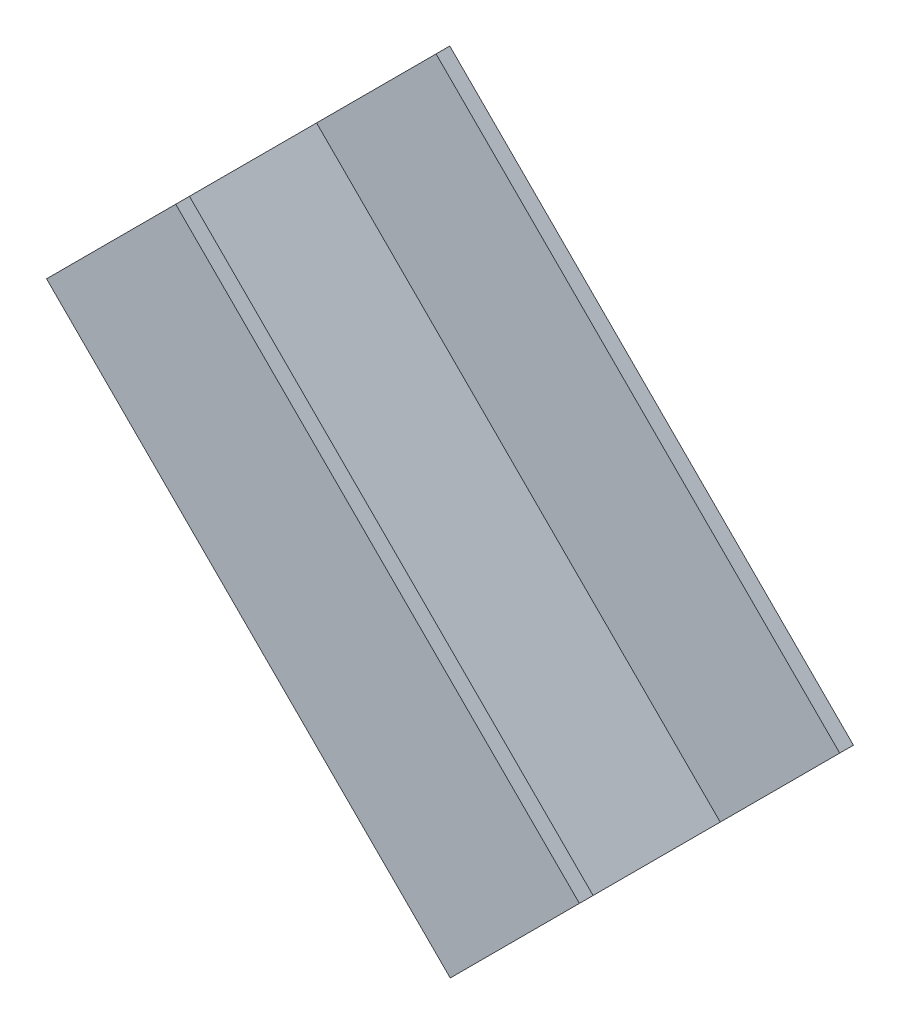
ISO-10303-21;
HEADER;
FILE_DESCRIPTION(('STEP AP214'),'2;1');
FILE_NAME('part.step','',(''),(''),'','','');
FILE_SCHEMA(('AUTOMOTIVE_DESIGN { 1 0 10303 214 1 1 1 1 }'));
ENDSEC;
DATA;
#1=APPLICATION_CONTEXT('core data for automotive mechanical design processes');
#2=APPLICATION_PROTOCOL_DEFINITION('international standard','automotive_design',2000,#1);
#3=PRODUCT_CONTEXT('',#1,'mechanical');
#4=PRODUCT('Part','Part','',(#3));
#5=PRODUCT_RELATED_PRODUCT_CATEGORY('part','',(#4));
#6=PRODUCT_DEFINITION_FORMATION('','',#4);
#7=PRODUCT_DEFINITION_CONTEXT('part definition',#1,'design');
#8=PRODUCT_DEFINITION('design','',#6,#7);
#9=PRODUCT_DEFINITION_SHAPE('','',#8);
#10=(LENGTH_UNIT() NAMED_UNIT(*) SI_UNIT(.MILLI.,.METRE.));
#11=(NAMED_UNIT(*) PLANE_ANGLE_UNIT() SI_UNIT($,.RADIAN.));
#12=(NAMED_UNIT(*) SI_UNIT($,.STERADIAN.) SOLID_ANGLE_UNIT());
#13=UNCERTAINTY_MEASURE_WITH_UNIT(LENGTH_MEASURE(1.E-05),#10,'distance_accuracy_value','');
#14=(GEOMETRIC_REPRESENTATION_CONTEXT(3) GLOBAL_UNCERTAINTY_ASSIGNED_CONTEXT((#13)) GLOBAL_UNIT_ASSIGNED_CONTEXT((#10,
#11,#12)) REPRESENTATION_CONTEXT('',''));
#15=CARTESIAN_POINT('',(0.,0.,0.));
#16=DIRECTION('',(0.,0.,1.));
#17=DIRECTION('',(1.,0.,0.));
#18=AXIS2_PLACEMENT_3D('',#15,#16,#17);
#19=CARTESIAN_POINT('',(-21.371733371294,-1.77362493427944,-0.0329990139287155));
#20=CARTESIAN_POINT('',(-21.3717333724067,-1.77362493631395,0.00300098607128494));
#21=CARTESIAN_POINT('',(-22.4323935430739,-0.712964762499555,-0.032998986769929));
#22=CARTESIAN_POINT('',(-22.4323935441866,-0.712964764534064,0.00300101323007142));
#23=(BOUNDED_SURFACE() B_SPLINE_SURFACE(1,1,((#19,#20),(#21,#22)),.UNSPECIFIED.,.F.,.F.,
.F.) B_SPLINE_SURFACE_WITH_KNOTS((2,2),(2,2),(-0.00137500000000004,0.000125000000000046),
(-3.00000000000031E-06,3.3E-05),
.UNSPECIFIED.) GEOMETRIC_REPRESENTATION_ITEM() RATIONAL_B_SPLINE_SURFACE(((1.,1.),(1.,1.))) REPRESENTATION_ITEM('') SURFACE());
#24=CARTESIAN_POINT('',(-22.3440051964456,-0.801353112012878,1.01096683888507E-06));
#25=CARTESIAN_POINT('',(-22.3440051955183,-0.801353110317454,-0.0299989890331612));
#26=(BOUNDED_CURVE() B_SPLINE_CURVE(1,(#24,#25),.UNSPECIFIED.,.F.,
.F.) B_SPLINE_CURVE_WITH_KNOTS((2,2),(-3.E-05,0.),
.UNSPECIFIED.) CURVE() GEOMETRIC_REPRESENTATION_ITEM() RATIONAL_B_SPLINE_CURVE((1.,1.)) REPRESENTATION_ITEM(''));
#27=CARTESIAN_POINT('',(-22.3440051964456,-0.801353112012876,1.0109668388894E-06));
#28=VERTEX_POINT('',#27);
#29=CARTESIAN_POINT('',(-22.3440051955183,-0.801353110317454,-0.0299989890331612));
#30=VERTEX_POINT('',#29);
#31=EDGE_CURVE('E85',#28,#30,#26,.T.);
#32=CARTESIAN_POINT('',(-21.4601217199623,-1.68523658849605,9.88334517091488E-07));
#33=CARTESIAN_POINT('',(-22.3440051964455,-0.801353112012814,1.01096683916167E-06));
#34=(BOUNDED_CURVE() B_SPLINE_CURVE(1,(#32,#33),.UNSPECIFIED.,.F.,
.F.) B_SPLINE_CURVE_WITH_KNOTS((2,2),(0.,0.00125000000000007),
.UNSPECIFIED.) CURVE() GEOMETRIC_REPRESENTATION_ITEM() RATIONAL_B_SPLINE_CURVE((1.,1.)) REPRESENTATION_ITEM(''));
#35=CARTESIAN_POINT('',(-21.4601217199623,-1.68523658849605,9.88334517091488E-07));
#36=VERTEX_POINT('',#35);
#37=EDGE_CURVE('E113',#36,#28,#34,.T.);
#38=CARTESIAN_POINT('',(-21.4601217199624,-1.68523658849605,9.88334517087151E-07));
#39=CARTESIAN_POINT('',(-21.4601217190351,-1.68523658680063,-0.029999011665483));
#40=(BOUNDED_CURVE() B_SPLINE_CURVE(1,(#38,#39),.UNSPECIFIED.,.F.,
.F.) B_SPLINE_CURVE_WITH_KNOTS((2,2),(-3.E-05,0.),
.UNSPECIFIED.) CURVE() GEOMETRIC_REPRESENTATION_ITEM() RATIONAL_B_SPLINE_CURVE((1.,1.)) REPRESENTATION_ITEM(''));
#41=CARTESIAN_POINT('',(-21.4601217190351,-1.68523658680063,-0.029999011665483));
#42=VERTEX_POINT('',#41);
#43=EDGE_CURVE('E87',#36,#42,#40,.T.);
#44=CARTESIAN_POINT('',(-21.4601217190351,-1.68523658680063,-0.029999011665483));
#45=CARTESIAN_POINT('',(-22.3440051955183,-0.801353110317442,-0.0299989890331609));
#46=(BOUNDED_CURVE() B_SPLINE_CURVE(1,(#44,#45),.UNSPECIFIED.,.F.,
.F.) B_SPLINE_CURVE_WITH_KNOTS((2,2),(0.,0.00125),
.UNSPECIFIED.) CURVE() GEOMETRIC_REPRESENTATION_ITEM() RATIONAL_B_SPLINE_CURVE((1.,1.)) REPRESENTATION_ITEM(''));
#47=EDGE_CURVE('E11',#42,#30,#46,.T.);
#48=ORIENTED_EDGE('',*,*,#31,.F.);
#49=ORIENTED_EDGE('',*,*,#37,.F.);
#50=ORIENTED_EDGE('',*,*,#43,.T.);
#51=ORIENTED_EDGE('',*,*,#47,.T.);
#52=EDGE_LOOP('',(#48,#49,#50,#51));
#53=FACE_BOUND('',#52,.T.);
#54=ADVANCED_FACE('F17',(#53),#23,.T.);
#55=CARTESIAN_POINT('',(-21.3455704204829,-1.74746198354504,-0.0299990116414784));
#56=CARTESIAN_POINT('',(-22.4062305922627,-0.686801811765215,-0.0299989844826919));
#57=CARTESIAN_POINT('',(-21.6595258313297,-2.06141739439192,-0.0299990390883204));
#58=CARTESIAN_POINT('',(-22.7201860031096,-1.0007572226121,-0.0299990119295339));
#59=(BOUNDED_SURFACE() B_SPLINE_SURFACE(1,1,((#55,#56),(#57,#58)),.UNSPECIFIED.,.F.,.F.,
.F.) B_SPLINE_SURFACE_WITH_KNOTS((2,2),(2,2),(-0.000407000000000068,3.70000000000087E-05),
(-0.000125000000000004,0.001375),
.UNSPECIFIED.) GEOMETRIC_REPRESENTATION_ITEM() RATIONAL_B_SPLINE_SURFACE(((1.,1.),(1.,1.))) REPRESENTATION_ITEM('') SURFACE());
#60=CARTESIAN_POINT('',(-22.3440051955183,-0.801353110317454,-0.0299989890331612));
#61=CARTESIAN_POINT('',(-22.6056347045573,-1.06298261935646,-0.0299990119055296));
#62=(BOUNDED_CURVE() B_SPLINE_CURVE(1,(#60,#61),.UNSPECIFIED.,.F.,
.F.) B_SPLINE_CURVE_WITH_KNOTS((2,2),(0.,0.000369999999999983),
.UNSPECIFIED.) CURVE() GEOMETRIC_REPRESENTATION_ITEM() RATIONAL_B_SPLINE_CURVE((1.,1.)) REPRESENTATION_ITEM(''));
#63=CARTESIAN_POINT('',(-22.6056347045573,-1.06298261935647,-0.0299990119055293));
#64=VERTEX_POINT('',#63);
#65=EDGE_CURVE('E89',#30,#64,#62,.T.);
#66=CARTESIAN_POINT('',(-21.4601217190351,-1.68523658680063,-0.029999011665483));
#67=CARTESIAN_POINT('',(-21.7217512280742,-1.9468660958397,-0.0299990345378514));
#68=(BOUNDED_CURVE() B_SPLINE_CURVE(1,(#66,#67),.UNSPECIFIED.,.F.,
.F.) B_SPLINE_CURVE_WITH_KNOTS((2,2),(0.,0.000370000000000062),
.UNSPECIFIED.) CURVE() GEOMETRIC_REPRESENTATION_ITEM() RATIONAL_B_SPLINE_CURVE((1.,1.)) REPRESENTATION_ITEM(''));
#69=CARTESIAN_POINT('',(-21.7217512280742,-1.94686609583966,-0.0299990345378515));
#70=VERTEX_POINT('',#69);
#71=EDGE_CURVE('E167',#42,#70,#68,.T.);
#72=CARTESIAN_POINT('',(-21.7217512280742,-1.94686609583966,-0.0299990345378515));
#73=CARTESIAN_POINT('',(-22.6056347045573,-1.06298261935651,-0.0299990119055294));
#74=(BOUNDED_CURVE() B_SPLINE_CURVE(1,(#72,#73),.UNSPECIFIED.,.F.,
.F.) B_SPLINE_CURVE_WITH_KNOTS((2,2),(0.,0.00124999999999995),
.UNSPECIFIED.) CURVE() GEOMETRIC_REPRESENTATION_ITEM() RATIONAL_B_SPLINE_CURVE((1.,1.)) REPRESENTATION_ITEM(''));
#75=EDGE_CURVE('E31',#70,#64,#74,.T.);
#76=ORIENTED_EDGE('',*,*,#65,.F.);
#77=ORIENTED_EDGE('',*,*,#47,.F.);
#78=ORIENTED_EDGE('',*,*,#71,.T.);
#79=ORIENTED_EDGE('',*,*,#75,.T.);
#80=EDGE_LOOP('',(#76,#77,#78,#79));
#81=FACE_BOUND('',#80,.T.);
#82=ADVANCED_FACE('F90',(#81),#59,.T.);
#83=CARTESIAN_POINT('',(-21.6333628620662,-2.0352544099186,-0.623999036801084));
#84=CARTESIAN_POINT('',(-21.6333628820949,-2.03525444653977,0.0240009631989165));
#85=CARTESIAN_POINT('',(-22.694023033846,-0.974594238138771,-0.623999009642297));
#86=CARTESIAN_POINT('',(-22.6940230538748,-0.974594274759936,0.0240009903577029));
#87=(BOUNDED_SURFACE() B_SPLINE_SURFACE(1,1,((#83,#84),(#85,#86)),.UNSPECIFIED.,.F.,.F.,
.F.) B_SPLINE_SURFACE_WITH_KNOTS((2,2),(2,2),(-0.00137499999999998,0.000125000000000037),
(-0.000594,5.4E-05),
.UNSPECIFIED.) GEOMETRIC_REPRESENTATION_ITEM() RATIONAL_B_SPLINE_SURFACE(((1.,1.),(1.,1.))) REPRESENTATION_ITEM('') SURFACE());
#88=CARTESIAN_POINT('',(-22.6056347045573,-1.06298261935647,-0.0299990119055293));
#89=CARTESIAN_POINT('',(-22.6056346878667,-1.06298258883883,-0.569999011905529));
#90=(BOUNDED_CURVE() B_SPLINE_CURVE(1,(#88,#89),.UNSPECIFIED.,.F.,
.F.) B_SPLINE_CURVE_WITH_KNOTS((2,2),(0.,0.00054),
.UNSPECIFIED.) CURVE() GEOMETRIC_REPRESENTATION_ITEM() RATIONAL_B_SPLINE_CURVE((1.,1.)) REPRESENTATION_ITEM(''));
#91=CARTESIAN_POINT('',(-22.6056346878667,-1.06298258883883,-0.569999011905529));
#92=VERTEX_POINT('',#91);
#93=EDGE_CURVE('E94',#64,#92,#90,.T.);
#94=CARTESIAN_POINT('',(-21.7217512280742,-1.94686609583966,-0.0299990345378515));
#95=CARTESIAN_POINT('',(-21.7217512113836,-1.94686606532202,-0.569999034537851));
#96=(BOUNDED_CURVE() B_SPLINE_CURVE(1,(#94,#95),.UNSPECIFIED.,.F.,
.F.) B_SPLINE_CURVE_WITH_KNOTS((2,2),(0.,0.00054),
.UNSPECIFIED.) CURVE() GEOMETRIC_REPRESENTATION_ITEM() RATIONAL_B_SPLINE_CURVE((1.,1.)) REPRESENTATION_ITEM(''));
#97=CARTESIAN_POINT('',(-21.7217512113835,-1.94686606532201,-0.569999034537851));
#98=VERTEX_POINT('',#97);
#99=EDGE_CURVE('E159',#70,#98,#96,.T.);
#100=CARTESIAN_POINT('',(-21.7217512113835,-1.94686606532201,-0.569999034537851));
#101=CARTESIAN_POINT('',(-22.6056346878667,-1.06298258883882,-0.569999011905529));
#102=(BOUNDED_CURVE() B_SPLINE_CURVE(1,(#100,#101),.UNSPECIFIED.,.F.,
.F.) B_SPLINE_CURVE_WITH_KNOTS((2,2),(0.,0.00125),
.UNSPECIFIED.) CURVE() GEOMETRIC_REPRESENTATION_ITEM() RATIONAL_B_SPLINE_CURVE((1.,1.)) REPRESENTATION_ITEM(''));
#103=EDGE_CURVE('E136',#98,#92,#102,.T.);
#104=ORIENTED_EDGE('',*,*,#93,.F.);
#105=ORIENTED_EDGE('',*,*,#75,.F.);
#106=ORIENTED_EDGE('',*,*,#99,.T.);
#107=ORIENTED_EDGE('',*,*,#103,.T.);
#108=EDGE_LOOP('',(#104,#105,#106,#107));
#109=FACE_BOUND('',#108,.T.);
#110=ADVANCED_FACE('F298',(#109),#87,.T.);
#111=CARTESIAN_POINT('',(-21.3455704037923,-1.74746195302742,-0.569999011641478));
#112=CARTESIAN_POINT('',(-21.6595258146391,-2.06141736387425,-0.56999903908832));
#113=CARTESIAN_POINT('',(-22.4062305755721,-0.686801781247578,-0.569998984482691));
#114=CARTESIAN_POINT('',(-22.7201859864189,-1.0007571920944,-0.569999011929534));
#115=(BOUNDED_SURFACE() B_SPLINE_SURFACE(1,1,((#111,#112),(#113,#114)),.UNSPECIFIED.,.F.,.F.,
.F.) B_SPLINE_SURFACE_WITH_KNOTS((2,2),(2,2),(-0.00137500000000003,0.000125000000000004),
(-0.000406999999999978,3.70000000000172E-05),
.UNSPECIFIED.) GEOMETRIC_REPRESENTATION_ITEM() RATIONAL_B_SPLINE_SURFACE(((1.,1.),(1.,1.))) REPRESENTATION_ITEM('') SURFACE());
#116=CARTESIAN_POINT('',(-22.6056346878667,-1.06298258883883,-0.569999011905529));
#117=CARTESIAN_POINT('',(-22.3440051788277,-0.801353079799819,-0.569998989033161));
#118=(BOUNDED_CURVE() B_SPLINE_CURVE(1,(#116,#117),.UNSPECIFIED.,.F.,
.F.) B_SPLINE_CURVE_WITH_KNOTS((2,2),(0.,0.000369999999999986),
.UNSPECIFIED.) CURVE() GEOMETRIC_REPRESENTATION_ITEM() RATIONAL_B_SPLINE_CURVE((1.,1.)) REPRESENTATION_ITEM(''));
#119=CARTESIAN_POINT('',(-22.3440051788277,-0.80135307979981,-0.56999898903316));
#120=VERTEX_POINT('',#119);
#121=EDGE_CURVE('E109',#92,#120,#118,.T.);
#122=CARTESIAN_POINT('',(-21.7217512113835,-1.94686606532201,-0.569999034537851));
#123=CARTESIAN_POINT('',(-21.4601217023445,-1.68523655628301,-0.569999011665483));
#124=(BOUNDED_CURVE() B_SPLINE_CURVE(1,(#122,#123),.UNSPECIFIED.,.F.,
.F.) B_SPLINE_CURVE_WITH_KNOTS((2,2),(0.,0.000369999999999976),
.UNSPECIFIED.) CURVE() GEOMETRIC_REPRESENTATION_ITEM() RATIONAL_B_SPLINE_CURVE((1.,1.)) REPRESENTATION_ITEM(''));
#125=CARTESIAN_POINT('',(-21.4601217023445,-1.685236556283,-0.569999011665483));
#126=VERTEX_POINT('',#125);
#127=EDGE_CURVE('E157',#98,#126,#124,.T.);
#128=CARTESIAN_POINT('',(-21.4601217023445,-1.685236556283,-0.569999011665483));
#129=CARTESIAN_POINT('',(-22.3440051788277,-0.801353079799805,-0.569998989033161));
#130=(BOUNDED_CURVE() B_SPLINE_CURVE(1,(#128,#129),.UNSPECIFIED.,.F.,
.F.) B_SPLINE_CURVE_WITH_KNOTS((2,2),(0.,0.00125000000000002),
.UNSPECIFIED.) CURVE() GEOMETRIC_REPRESENTATION_ITEM() RATIONAL_B_SPLINE_CURVE((1.,1.)) REPRESENTATION_ITEM(''));
#131=EDGE_CURVE('E127',#126,#120,#130,.T.);
#132=ORIENTED_EDGE('',*,*,#121,.F.);
#133=ORIENTED_EDGE('',*,*,#103,.F.);
#134=ORIENTED_EDGE('',*,*,#127,.T.);
#135=ORIENTED_EDGE('',*,*,#131,.T.);
#136=EDGE_LOOP('',(#132,#133,#134,#135));
#137=FACE_BOUND('',#136,.T.);
#138=ADVANCED_FACE('F302',(#137),#115,.T.);
#139=CARTESIAN_POINT('',(-21.3717333536762,-1.77362490206635,-0.602999013928715));
#140=CARTESIAN_POINT('',(-21.3717333547889,-1.77362490410086,-0.566999013928714));
#141=CARTESIAN_POINT('',(-22.432393525456,-0.712964730286492,-0.602998986769929));
#142=CARTESIAN_POINT('',(-22.4323935265687,-0.712964732321001,-0.566998986769928));
#143=(BOUNDED_SURFACE() B_SPLINE_SURFACE(1,1,((#139,#140),(#141,#142)),.UNSPECIFIED.,.F.,.F.,
.F.) B_SPLINE_SURFACE_WITH_KNOTS((2,2),(2,2),(-0.00137500000000005,0.000125000000000006),
(-0.000573,-0.000537),
.UNSPECIFIED.) GEOMETRIC_REPRESENTATION_ITEM() RATIONAL_B_SPLINE_SURFACE(((1.,1.),(1.,1.))) REPRESENTATION_ITEM('') SURFACE());
#144=CARTESIAN_POINT('',(-22.3440051788277,-0.801353079799814,-0.56999898903316));
#145=CARTESIAN_POINT('',(-22.3440051779004,-0.801353078104389,-0.599998989033161));
#146=(BOUNDED_CURVE() B_SPLINE_CURVE(1,(#144,#145),.UNSPECIFIED.,.F.,
.F.) B_SPLINE_CURVE_WITH_KNOTS((2,2),(0.00057,0.0006),
.UNSPECIFIED.) CURVE() GEOMETRIC_REPRESENTATION_ITEM() RATIONAL_B_SPLINE_CURVE((1.,1.)) REPRESENTATION_ITEM(''));
#147=CARTESIAN_POINT('',(-22.3440051779004,-0.801353078104389,-0.599998989033161));
#148=VERTEX_POINT('',#147);
#149=EDGE_CURVE('E138',#120,#148,#146,.T.);
#150=CARTESIAN_POINT('',(-21.4601217023445,-1.68523655628299,-0.569999011665483));
#151=CARTESIAN_POINT('',(-21.4601217014172,-1.68523655458757,-0.599999011665483));
#152=(BOUNDED_CURVE() B_SPLINE_CURVE(1,(#150,#151),.UNSPECIFIED.,.F.,
.F.) B_SPLINE_CURVE_WITH_KNOTS((2,2),(0.00054,0.00057),
.UNSPECIFIED.) CURVE() GEOMETRIC_REPRESENTATION_ITEM() RATIONAL_B_SPLINE_CURVE((1.,1.)) REPRESENTATION_ITEM(''));
#153=CARTESIAN_POINT('',(-21.4601217014172,-1.68523655458757,-0.599999011665483));
#154=VERTEX_POINT('',#153);
#155=EDGE_CURVE('E148',#126,#154,#152,.T.);
#156=CARTESIAN_POINT('',(-21.4601217014172,-1.68523655458757,-0.599999011665483));
#157=CARTESIAN_POINT('',(-22.3440051779004,-0.80135307810438,-0.599998989033161));
#158=(BOUNDED_CURVE() B_SPLINE_CURVE(1,(#156,#157),.UNSPECIFIED.,.F.,
.F.) B_SPLINE_CURVE_WITH_KNOTS((2,2),(0.,0.00125),
.UNSPECIFIED.) CURVE() GEOMETRIC_REPRESENTATION_ITEM() RATIONAL_B_SPLINE_CURVE((1.,1.)) REPRESENTATION_ITEM(''));
#159=EDGE_CURVE('E137',#154,#148,#158,.T.);
#160=ORIENTED_EDGE('',*,*,#149,.F.);
#161=ORIENTED_EDGE('',*,*,#131,.F.);
#162=ORIENTED_EDGE('',*,*,#155,.T.);
#163=ORIENTED_EDGE('',*,*,#159,.T.);
#164=EDGE_LOOP('',(#160,#161,#162,#163));
#165=FACE_BOUND('',#164,.T.);
#166=ADVANCED_FACE('F408',(#165),#143,.T.);
#167=CARTESIAN_POINT('',(-22.4041092543013,-0.684680459208597,-0.59999898429724));
#168=CARTESIAN_POINT('',(-22.7435205092708,-1.02409171417814,-0.599999013969501));
#169=CARTESIAN_POINT('',(-21.3434490825214,-1.74534063098844,-0.599999011456026));
#170=CARTESIAN_POINT('',(-21.6828603374909,-2.08475188595798,-0.599999041128288));
#171=(BOUNDED_SURFACE() B_SPLINE_SURFACE(1,1,((#167,#168),(#169,#170)),.UNSPECIFIED.,.F.,.F.,
.F.) B_SPLINE_SURFACE_WITH_KNOTS((2,2),(2,2),(-0.000125000000000004,0.00137500000000003),
(-0.000439999999999987,4.00000000000103E-05),
.UNSPECIFIED.) GEOMETRIC_REPRESENTATION_ITEM() RATIONAL_B_SPLINE_SURFACE(((1.,1.),(1.,1.))) REPRESENTATION_ITEM('') SURFACE());
#172=CARTESIAN_POINT('',(-22.3440051779004,-0.801353078104393,-0.59999898903316));
#173=CARTESIAN_POINT('',(-22.626847890375,-1.084195790579,-0.599999013760045));
#174=(BOUNDED_CURVE() B_SPLINE_CURVE(1,(#172,#173),.UNSPECIFIED.,.F.,
.F.) B_SPLINE_CURVE_WITH_KNOTS((2,2),(-0.000399999999999984,0.),
.UNSPECIFIED.) CURVE() GEOMETRIC_REPRESENTATION_ITEM() RATIONAL_B_SPLINE_CURVE((1.,1.)) REPRESENTATION_ITEM(''));
#175=CARTESIAN_POINT('',(-22.626847890375,-1.084195790579,-0.599999013760045));
#176=VERTEX_POINT('',#175);
#177=EDGE_CURVE('E147',#148,#176,#174,.T.);
#178=CARTESIAN_POINT('',(-21.4601217014172,-1.68523655458758,-0.599999011665482));
#179=CARTESIAN_POINT('',(-21.7429644138918,-1.96807926706219,-0.599999036392367));
#180=(BOUNDED_CURVE() B_SPLINE_CURVE(1,(#178,#179),.UNSPECIFIED.,.F.,
.F.) B_SPLINE_CURVE_WITH_KNOTS((2,2),(-0.000399999999999987,0.),
.UNSPECIFIED.) CURVE() GEOMETRIC_REPRESENTATION_ITEM() RATIONAL_B_SPLINE_CURVE((1.,1.)) REPRESENTATION_ITEM(''));
#181=CARTESIAN_POINT('',(-21.7429644138918,-1.96807926706219,-0.599999036392367));
#182=VERTEX_POINT('',#181);
#183=EDGE_CURVE('E158',#154,#182,#180,.T.);
#184=CARTESIAN_POINT('',(-21.7429644138918,-1.96807926706219,-0.599999036392367));
#185=CARTESIAN_POINT('',(-22.626847890375,-1.08419579057899,-0.599999013760045));
#186=(BOUNDED_CURVE() B_SPLINE_CURVE(1,(#184,#185),.UNSPECIFIED.,.F.,
.F.) B_SPLINE_CURVE_WITH_KNOTS((2,2),(0.,0.00125000000000002),
.UNSPECIFIED.) CURVE() GEOMETRIC_REPRESENTATION_ITEM() RATIONAL_B_SPLINE_CURVE((1.,1.)) REPRESENTATION_ITEM(''));
#187=EDGE_CURVE('E120',#182,#176,#186,.T.);
#188=ORIENTED_EDGE('',*,*,#177,.F.);
#189=ORIENTED_EDGE('',*,*,#159,.F.);
#190=ORIENTED_EDGE('',*,*,#183,.T.);
#191=ORIENTED_EDGE('',*,*,#187,.T.);
#192=EDGE_LOOP('',(#188,#189,#190,#191));
#193=FACE_BOUND('',#192,.T.);
#194=ADVANCED_FACE('F19',(#193),#171,.T.);
#195=CARTESIAN_POINT('',(-22.7152362361688,-0.995807439539844,-0.659999011496813));
#196=CARTESIAN_POINT('',(-22.715236258423,-0.995807480230028,0.0600009885031866));
#197=CARTESIAN_POINT('',(-21.654576064389,-2.05646761131968,-0.6599990386556));
#198=CARTESIAN_POINT('',(-21.6545760866432,-2.05646765200986,0.0600009613444));
#199=(BOUNDED_SURFACE() B_SPLINE_SURFACE(1,1,((#195,#196),(#197,#198)),.UNSPECIFIED.,.F.,.F.,
.F.) B_SPLINE_SURFACE_WITH_KNOTS((2,2),(2,2),(-0.000125000000000038,0.00137499999999998),
(-0.00066,6.E-05),.UNSPECIFIED.) GEOMETRIC_REPRESENTATION_ITEM() RATIONAL_B_SPLINE_SURFACE(((1.,
1.),(1.,1.))) REPRESENTATION_ITEM('') SURFACE());
#200=CARTESIAN_POINT('',(-22.6268478903749,-1.084195790579,-0.599999013760045));
#201=CARTESIAN_POINT('',(-22.6268479089201,-1.08419582448749,9.86239954287038E-07));
#202=(BOUNDED_CURVE() B_SPLINE_CURVE(1,(#200,#201),.UNSPECIFIED.,.F.,
.F.) B_SPLINE_CURVE_WITH_KNOTS((2,2),(-0.0006,0.),
.UNSPECIFIED.) CURVE() GEOMETRIC_REPRESENTATION_ITEM() RATIONAL_B_SPLINE_CURVE((1.,1.)) REPRESENTATION_ITEM(''));
#203=CARTESIAN_POINT('',(-22.6268479089201,-1.08419582448749,9.86239954287038E-07));
#204=VERTEX_POINT('',#203);
#205=EDGE_CURVE('E234',#176,#204,#202,.T.);
#206=CARTESIAN_POINT('',(-21.7429644138918,-1.96807926706218,-0.599999036392367));
#207=CARTESIAN_POINT('',(-21.742964432437,-1.96807930097067,9.63607632055441E-07));
#208=(BOUNDED_CURVE() B_SPLINE_CURVE(1,(#206,#207),.UNSPECIFIED.,.F.,
.F.) B_SPLINE_CURVE_WITH_KNOTS((2,2),(-0.0006,0.),
.UNSPECIFIED.) CURVE() GEOMETRIC_REPRESENTATION_ITEM() RATIONAL_B_SPLINE_CURVE((1.,1.)) REPRESENTATION_ITEM(''));
#209=CARTESIAN_POINT('',(-21.742964432437,-1.96807930097067,9.63607632055441E-07));
#210=VERTEX_POINT('',#209);
#211=EDGE_CURVE('E205',#182,#210,#208,.T.);
#212=CARTESIAN_POINT('',(-21.742964432437,-1.96807930097067,9.63607632055441E-07));
#213=CARTESIAN_POINT('',(-22.6268479089201,-1.08419582448753,9.86239954125625E-07));
#214=(BOUNDED_CURVE() B_SPLINE_CURVE(1,(#212,#213),.UNSPECIFIED.,.F.,
.F.) B_SPLINE_CURVE_WITH_KNOTS((2,2),(0.,0.00124999999999994),
.UNSPECIFIED.) CURVE() GEOMETRIC_REPRESENTATION_ITEM() RATIONAL_B_SPLINE_CURVE((1.,1.)) REPRESENTATION_ITEM(''));
#215=EDGE_CURVE('E67',#210,#204,#214,.T.);
#216=ORIENTED_EDGE('',*,*,#205,.F.);
#217=ORIENTED_EDGE('',*,*,#187,.F.);
#218=ORIENTED_EDGE('',*,*,#211,.T.);
#219=ORIENTED_EDGE('',*,*,#215,.T.);
#220=EDGE_LOOP('',(#216,#217,#218,#219));
#221=FACE_BOUND('',#220,.T.);
#222=ADVANCED_FACE('F233',(#221),#199,.T.);
#223=CARTESIAN_POINT('',(-21.6828603560361,-2.0847519198665,9.58871711755183E-07));
#224=CARTESIAN_POINT('',(-22.743520527816,-1.02409174808662,9.86030498239407E-07));
#225=CARTESIAN_POINT('',(-21.3434491010665,-1.74534066489691,9.88543973350768E-07));
#226=CARTESIAN_POINT('',(-22.4041092728464,-0.684680493117023,1.01570275983499E-06));
#227=(BOUNDED_SURFACE() B_SPLINE_SURFACE(1,1,((#223,#224),(#225,#226)),.UNSPECIFIED.,.F.,.F.,
.F.) B_SPLINE_SURFACE_WITH_KNOTS((2,2),(2,2),(-4.00000000000089E-05,0.000440000000000066),
(-0.000125000000000008,0.00137500000000008),
.UNSPECIFIED.) GEOMETRIC_REPRESENTATION_ITEM() RATIONAL_B_SPLINE_SURFACE(((1.,1.),(1.,1.))) REPRESENTATION_ITEM('') SURFACE());
#228=CARTESIAN_POINT('',(-22.6268479089202,-1.08419582448744,9.86239954226422E-07));
#229=CARTESIAN_POINT('',(-22.3440051964456,-0.801353112012876,1.0109668388894E-06));
#230=(BOUNDED_CURVE() B_SPLINE_CURVE(1,(#228,#229),.UNSPECIFIED.,.F.,
.F.) B_SPLINE_CURVE_WITH_KNOTS((2,2),(-0.000399999999999917,0.),
.UNSPECIFIED.) CURVE() GEOMETRIC_REPRESENTATION_ITEM() RATIONAL_B_SPLINE_CURVE((1.,1.)) REPRESENTATION_ITEM(''));
#231=EDGE_CURVE('E99',#204,#28,#230,.T.);
#232=CARTESIAN_POINT('',(-21.742964432437,-1.96807930097071,9.63607632428501E-07));
#233=CARTESIAN_POINT('',(-21.4601217199623,-1.68523658849605,9.88334517091488E-07));
#234=(BOUNDED_CURVE() B_SPLINE_CURVE(1,(#232,#233),.UNSPECIFIED.,.F.,
.F.) B_SPLINE_CURVE_WITH_KNOTS((2,2),(-0.00040000000000006,0.),
.UNSPECIFIED.) CURVE() GEOMETRIC_REPRESENTATION_ITEM() RATIONAL_B_SPLINE_CURVE((1.,1.)) REPRESENTATION_ITEM(''));
#235=EDGE_CURVE('E189',#210,#36,#234,.T.);
#236=ORIENTED_EDGE('',*,*,#231,.F.);
#237=ORIENTED_EDGE('',*,*,#215,.F.);
#238=ORIENTED_EDGE('',*,*,#235,.T.);
#239=ORIENTED_EDGE('',*,*,#37,.T.);
#240=EDGE_LOOP('',(#236,#237,#238,#239));
#241=FACE_BOUND('',#240,.T.);
#242=ADVANCED_FACE('F239',(#241),#227,.T.);
#243=CARTESIAN_POINT('',(-21.7712486832848,-1.99636353491879,-0.659999038865056));
#244=CARTESIAN_POINT('',(-21.771248705539,-1.99636357560897,0.060000961134944));
#245=CARTESIAN_POINT('',(-21.4318374283152,-1.65695227994919,-0.659999009192794));
#246=CARTESIAN_POINT('',(-21.4318374505694,-1.65695232063937,0.0600009908072057));
#247=(BOUNDED_SURFACE() B_SPLINE_SURFACE(1,1,((#243,#244),(#245,#246)),.UNSPECIFIED.,.F.,.F.,
.F.) B_SPLINE_SURFACE_WITH_KNOTS((2,2),(2,2),(0.000559999999999897,0.00103999999999998),
(-0.00066,6.E-05),.UNSPECIFIED.) GEOMETRIC_REPRESENTATION_ITEM() RATIONAL_B_SPLINE_SURFACE(((1.,
1.),(1.,1.))) REPRESENTATION_ITEM('') SURFACE());
#248=ORIENTED_EDGE('',*,*,#43,.F.);
#249=ORIENTED_EDGE('',*,*,#235,.F.);
#250=ORIENTED_EDGE('',*,*,#211,.F.);
#251=ORIENTED_EDGE('',*,*,#183,.F.);
#252=ORIENTED_EDGE('',*,*,#155,.F.);
#253=ORIENTED_EDGE('',*,*,#127,.F.);
#254=ORIENTED_EDGE('',*,*,#99,.F.);
#255=ORIENTED_EDGE('',*,*,#71,.F.);
#256=EDGE_LOOP('',(#248,#249,#250,#251,#252,#253,#254,#255));
#257=FACE_BOUND('',#256,.T.);
#258=ADVANCED_FACE('F295',(#257),#247,.T.);
#259=CARTESIAN_POINT('',(-22.3157209047984,-0.773068803466089,-0.659998986560473));
#260=CARTESIAN_POINT('',(-22.3157209270526,-0.773068844156273,0.0600010134395276));
#261=CARTESIAN_POINT('',(-22.6551321597679,-1.11248005843562,-0.659999016232734));
#262=CARTESIAN_POINT('',(-22.6551321820221,-1.1124800991258,0.0600009837672658));
#263=(BOUNDED_SURFACE() B_SPLINE_SURFACE(1,1,((#259,#260),(#261,#262)),.UNSPECIFIED.,.F.,.F.,
.F.) B_SPLINE_SURFACE_WITH_KNOTS((2,2),(2,2),(0.000560000000000022,0.00104),(-0.00066,6.E-05),
.UNSPECIFIED.) GEOMETRIC_REPRESENTATION_ITEM() RATIONAL_B_SPLINE_SURFACE(((1.,1.),(1.,1.))) REPRESENTATION_ITEM('') SURFACE());
#264=ORIENTED_EDGE('',*,*,#31,.T.);
#265=ORIENTED_EDGE('',*,*,#65,.T.);
#266=ORIENTED_EDGE('',*,*,#93,.T.);
#267=ORIENTED_EDGE('',*,*,#121,.T.);
#268=ORIENTED_EDGE('',*,*,#149,.T.);
#269=ORIENTED_EDGE('',*,*,#177,.T.);
#270=ORIENTED_EDGE('',*,*,#205,.T.);
#271=ORIENTED_EDGE('',*,*,#231,.T.);
#272=EDGE_LOOP('',(#264,#265,#266,#267,#268,#269,#270,#271));
#273=FACE_BOUND('',#272,.T.);
#274=ADVANCED_FACE('F97',(#273),#263,.T.);
#275=CLOSED_SHELL('',(#54,#82,#110,#138,#166,#194,#222,#242,#258,#274));
#276=MANIFOLD_SOLID_BREP('B1',#275);
#277=ADVANCED_BREP_SHAPE_REPRESENTATION('',(#18,#276),#14);
#278=SHAPE_DEFINITION_REPRESENTATION(#9,#277);
ENDSEC;
END-ISO-10303-21;
